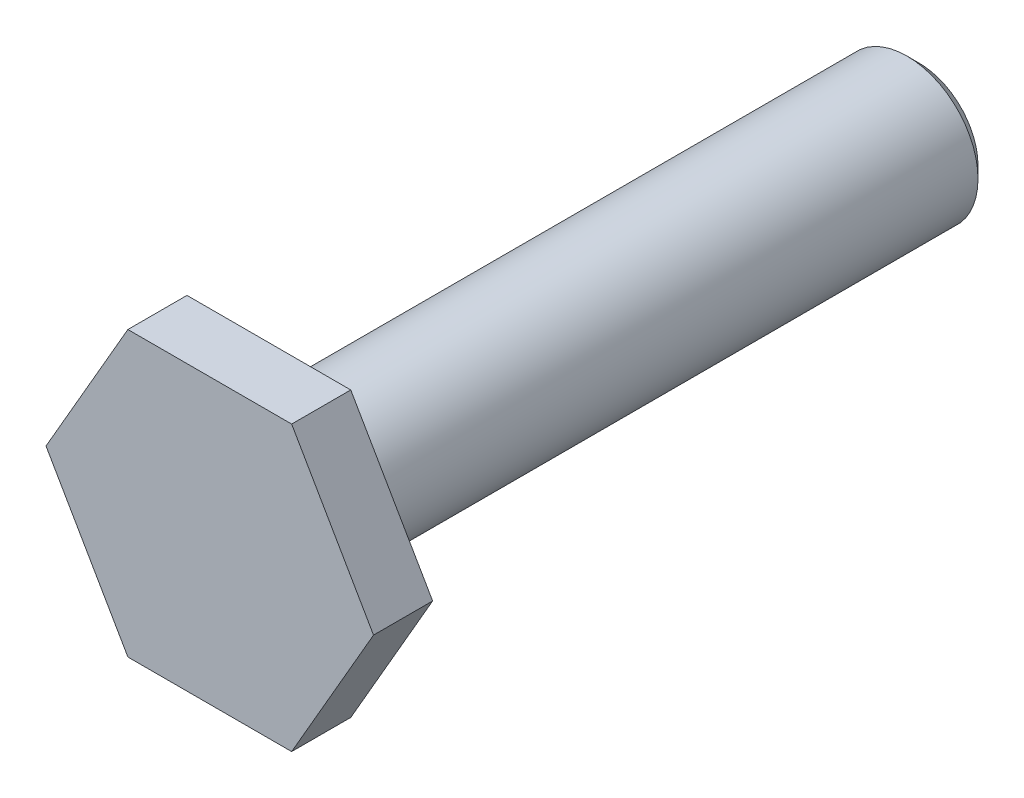
ISO-10303-21;
HEADER;
FILE_DESCRIPTION(('STEP AP214'),'2;1');
FILE_NAME('part.step','',(''),(''),'','','');
FILE_SCHEMA(('AUTOMOTIVE_DESIGN { 1 0 10303 214 1 1 1 1 }'));
ENDSEC;
DATA;
#1=APPLICATION_CONTEXT('core data for automotive mechanical design processes');
#2=APPLICATION_PROTOCOL_DEFINITION('international standard','automotive_design',2000,#1);
#3=PRODUCT_CONTEXT('',#1,'mechanical');
#4=PRODUCT('Part','Part','',(#3));
#5=PRODUCT_RELATED_PRODUCT_CATEGORY('part','',(#4));
#6=PRODUCT_DEFINITION_FORMATION('','',#4);
#7=PRODUCT_DEFINITION_CONTEXT('part definition',#1,'design');
#8=PRODUCT_DEFINITION('design','',#6,#7);
#9=PRODUCT_DEFINITION_SHAPE('','',#8);
#10=(LENGTH_UNIT() NAMED_UNIT(*) SI_UNIT(.MILLI.,.METRE.));
#11=(NAMED_UNIT(*) PLANE_ANGLE_UNIT() SI_UNIT($,.RADIAN.));
#12=(NAMED_UNIT(*) SI_UNIT($,.STERADIAN.) SOLID_ANGLE_UNIT());
#13=UNCERTAINTY_MEASURE_WITH_UNIT(LENGTH_MEASURE(1.E-05),#10,'distance_accuracy_value','');
#14=(GEOMETRIC_REPRESENTATION_CONTEXT(3) GLOBAL_UNCERTAINTY_ASSIGNED_CONTEXT((#13)) GLOBAL_UNIT_ASSIGNED_CONTEXT((#10,
#11,#12)) REPRESENTATION_CONTEXT('',''));
#15=CARTESIAN_POINT('',(0.,0.,0.));
#16=DIRECTION('',(0.,0.,1.));
#17=DIRECTION('',(1.,0.,0.));
#18=AXIS2_PLACEMENT_3D('',#15,#16,#17);
#19=CARTESIAN_POINT('',(0.,0.,5.));
#20=DIRECTION('',(0.,0.,1.));
#21=DIRECTION('',(1.,0.,0.));
#22=AXIS2_PLACEMENT_3D('',#19,#20,#21);
#23=PLANE('',#22);
#24=DIRECTION('',(0.5,-0.866025403784439,0.));
#25=VECTOR('',#24,1.);
#26=CARTESIAN_POINT('',(-6.92820323027551,-12.,5.));
#27=LINE('',#26,#25);
#28=CARTESIAN_POINT('',(-6.92820323027551,-12.,5.));
#29=VERTEX_POINT('',#28);
#30=CARTESIAN_POINT('',(-13.856406460551,0.,5.));
#31=VERTEX_POINT('',#30);
#32=EDGE_CURVE('E90',#29,#31,#27,.F.);
#33=ORIENTED_EDGE('',*,*,#32,.F.);
#34=DIRECTION('',(1.,0.,0.));
#35=VECTOR('',#34,1.);
#36=CARTESIAN_POINT('',(6.92820323027551,-12.,5.));
#37=LINE('',#36,#35);
#38=CARTESIAN_POINT('',(6.92820323027551,-12.,5.));
#39=VERTEX_POINT('',#38);
#40=EDGE_CURVE('E99',#39,#29,#37,.F.);
#41=ORIENTED_EDGE('',*,*,#40,.F.);
#42=DIRECTION('',(0.5,0.866025403784439,0.));
#43=VECTOR('',#42,1.);
#44=CARTESIAN_POINT('',(13.856406460551,0.,5.));
#45=LINE('',#44,#43);
#46=CARTESIAN_POINT('',(13.856406460551,0.,5.));
#47=VERTEX_POINT('',#46);
#48=EDGE_CURVE('E63',#47,#39,#45,.F.);
#49=ORIENTED_EDGE('',*,*,#48,.F.);
#50=DIRECTION('',(-0.5,0.866025403784439,0.));
#51=VECTOR('',#50,1.);
#52=CARTESIAN_POINT('',(6.92820323027552,12.,5.));
#53=LINE('',#52,#51);
#54=CARTESIAN_POINT('',(6.92820323027552,12.,5.));
#55=VERTEX_POINT('',#54);
#56=EDGE_CURVE('E67',#55,#47,#53,.F.);
#57=ORIENTED_EDGE('',*,*,#56,.F.);
#58=DIRECTION('',(1.,0.,0.));
#59=VECTOR('',#58,1.);
#60=CARTESIAN_POINT('',(-6.92820323027551,12.,5.));
#61=LINE('',#60,#59);
#62=CARTESIAN_POINT('',(-6.92820323027551,12.,5.));
#63=VERTEX_POINT('',#62);
#64=EDGE_CURVE('E77',#63,#55,#61,.T.);
#65=ORIENTED_EDGE('',*,*,#64,.F.);
#66=DIRECTION('',(-0.5,-0.866025403784439,0.));
#67=VECTOR('',#66,1.);
#68=CARTESIAN_POINT('',(-13.856406460551,0.,5.));
#69=LINE('',#68,#67);
#70=EDGE_CURVE('E80',#31,#63,#69,.F.);
#71=ORIENTED_EDGE('',*,*,#70,.F.);
#72=EDGE_LOOP('',(#33,#41,#49,#57,#65,#71));
#73=FACE_BOUND('',#72,.T.);
#74=ADVANCED_FACE('F17',(#73),#23,.T.);
#75=CARTESIAN_POINT('',(-6.92820323027551,12.,0.));
#76=DIRECTION('',(0.,1.,0.));
#77=DIRECTION('',(0.,0.,1.));
#78=AXIS2_PLACEMENT_3D('',#75,#76,#77);
#79=PLANE('',#78);
#80=DIRECTION('',(1.,0.,0.));
#81=VECTOR('',#80,1.);
#82=CARTESIAN_POINT('',(0.,12.,0.));
#83=LINE('',#82,#81);
#84=CARTESIAN_POINT('',(6.92820323027552,12.,0.));
#85=VERTEX_POINT('',#84);
#86=CARTESIAN_POINT('',(-6.92820323027551,12.,0.));
#87=VERTEX_POINT('',#86);
#88=EDGE_CURVE('E87',#85,#87,#83,.F.);
#89=ORIENTED_EDGE('',*,*,#88,.T.);
#90=DIRECTION('',(0.,0.,1.));
#91=VECTOR('',#90,1.);
#92=CARTESIAN_POINT('',(-6.92820323027551,12.,0.));
#93=LINE('',#92,#91);
#94=EDGE_CURVE('E84',#63,#87,#93,.F.);
#95=ORIENTED_EDGE('',*,*,#94,.F.);
#96=ORIENTED_EDGE('',*,*,#64,.T.);
#97=DIRECTION('',(0.,0.,1.));
#98=VECTOR('',#97,1.);
#99=CARTESIAN_POINT('',(6.92820323027552,12.,0.));
#100=LINE('',#99,#98);
#101=EDGE_CURVE('E55',#85,#55,#100,.T.);
#102=ORIENTED_EDGE('',*,*,#101,.F.);
#103=EDGE_LOOP('',(#89,#95,#96,#102));
#104=FACE_BOUND('',#103,.T.);
#105=ADVANCED_FACE('F85',(#104),#79,.T.);
#106=CARTESIAN_POINT('',(-13.856406460551,0.,0.));
#107=DIRECTION('',(-0.866025403784439,0.5,0.));
#108=DIRECTION('',(-0.5,-0.866025403784439,0.));
#109=AXIS2_PLACEMENT_3D('',#106,#107,#108);
#110=PLANE('',#109);
#111=DIRECTION('',(-0.5,-0.866025403784439,0.));
#112=VECTOR('',#111,1.);
#113=CARTESIAN_POINT('',(-6.92820323027551,12.,0.));
#114=LINE('',#113,#112);
#115=CARTESIAN_POINT('',(-13.856406460551,0.,0.));
#116=VERTEX_POINT('',#115);
#117=EDGE_CURVE('E120',#87,#116,#114,.T.);
#118=ORIENTED_EDGE('',*,*,#117,.T.);
#119=DIRECTION('',(0.,0.,1.));
#120=VECTOR('',#119,1.);
#121=CARTESIAN_POINT('',(-13.856406460551,0.,0.));
#122=LINE('',#121,#120);
#123=EDGE_CURVE('E94',#31,#116,#122,.F.);
#124=ORIENTED_EDGE('',*,*,#123,.F.);
#125=ORIENTED_EDGE('',*,*,#70,.T.);
#126=ORIENTED_EDGE('',*,*,#94,.T.);
#127=EDGE_LOOP('',(#118,#124,#125,#126));
#128=FACE_BOUND('',#127,.T.);
#129=ADVANCED_FACE('F92',(#128),#110,.T.);
#130=CARTESIAN_POINT('',(-6.92820323027551,-12.,0.));
#131=DIRECTION('',(-0.866025403784439,-0.5,0.));
#132=DIRECTION('',(0.5,-0.866025403784439,0.));
#133=AXIS2_PLACEMENT_3D('',#130,#131,#132);
#134=PLANE('',#133);
#135=DIRECTION('',(0.5,-0.866025403784439,0.));
#136=VECTOR('',#135,1.);
#137=CARTESIAN_POINT('',(-13.856406460551,0.,0.));
#138=LINE('',#137,#136);
#139=CARTESIAN_POINT('',(-6.92820323027551,-12.,0.));
#140=VERTEX_POINT('',#139);
#141=EDGE_CURVE('E118',#116,#140,#138,.T.);
#142=ORIENTED_EDGE('',*,*,#141,.T.);
#143=DIRECTION('',(0.,0.,1.));
#144=VECTOR('',#143,1.);
#145=CARTESIAN_POINT('',(-6.92820323027551,-12.,0.));
#146=LINE('',#145,#144);
#147=EDGE_CURVE('E101',#29,#140,#146,.F.);
#148=ORIENTED_EDGE('',*,*,#147,.F.);
#149=ORIENTED_EDGE('',*,*,#32,.T.);
#150=ORIENTED_EDGE('',*,*,#123,.T.);
#151=EDGE_LOOP('',(#142,#148,#149,#150));
#152=FACE_BOUND('',#151,.T.);
#153=ADVANCED_FACE('F191',(#152),#134,.T.);
#154=CARTESIAN_POINT('',(6.92820323027551,-12.,0.));
#155=DIRECTION('',(0.,-1.,0.));
#156=DIRECTION('',(1.,0.,0.));
#157=AXIS2_PLACEMENT_3D('',#154,#155,#156);
#158=PLANE('',#157);
#159=DIRECTION('',(1.,0.,0.));
#160=VECTOR('',#159,1.);
#161=CARTESIAN_POINT('',(0.,-12.,0.));
#162=LINE('',#161,#160);
#163=CARTESIAN_POINT('',(6.92820323027551,-12.,0.));
#164=VERTEX_POINT('',#163);
#165=EDGE_CURVE('E116',#140,#164,#162,.T.);
#166=ORIENTED_EDGE('',*,*,#165,.T.);
#167=DIRECTION('',(0.,0.,1.));
#168=VECTOR('',#167,1.);
#169=CARTESIAN_POINT('',(6.9282032302755,-12.,0.));
#170=LINE('',#169,#168);
#171=EDGE_CURVE('E106',#39,#164,#170,.F.);
#172=ORIENTED_EDGE('',*,*,#171,.F.);
#173=ORIENTED_EDGE('',*,*,#40,.T.);
#174=ORIENTED_EDGE('',*,*,#147,.T.);
#175=EDGE_LOOP('',(#166,#172,#173,#174));
#176=FACE_BOUND('',#175,.T.);
#177=ADVANCED_FACE('F182',(#176),#158,.T.);
#178=CARTESIAN_POINT('',(13.856406460551,0.,0.));
#179=DIRECTION('',(0.866025403784438,-0.5,0.));
#180=DIRECTION('',(0.5,0.866025403784439,0.));
#181=AXIS2_PLACEMENT_3D('',#178,#179,#180);
#182=PLANE('',#181);
#183=DIRECTION('',(0.5,0.866025403784439,0.));
#184=VECTOR('',#183,1.);
#185=CARTESIAN_POINT('',(6.92820323027551,-12.,0.));
#186=LINE('',#185,#184);
#187=CARTESIAN_POINT('',(13.856406460551,0.,0.));
#188=VERTEX_POINT('',#187);
#189=EDGE_CURVE('E36',#164,#188,#186,.T.);
#190=ORIENTED_EDGE('',*,*,#189,.T.);
#191=DIRECTION('',(0.,0.,1.));
#192=VECTOR('',#191,1.);
#193=CARTESIAN_POINT('',(13.856406460551,0.,0.));
#194=LINE('',#193,#192);
#195=EDGE_CURVE('E110',#47,#188,#194,.F.);
#196=ORIENTED_EDGE('',*,*,#195,.F.);
#197=ORIENTED_EDGE('',*,*,#48,.T.);
#198=ORIENTED_EDGE('',*,*,#171,.T.);
#199=EDGE_LOOP('',(#190,#196,#197,#198));
#200=FACE_BOUND('',#199,.T.);
#201=ADVANCED_FACE('F143',(#200),#182,.T.);
#202=CARTESIAN_POINT('',(6.92820323027552,12.,0.));
#203=DIRECTION('',(0.866025403784439,0.5,0.));
#204=DIRECTION('',(-0.5,0.866025403784439,0.));
#205=AXIS2_PLACEMENT_3D('',#202,#203,#204);
#206=PLANE('',#205);
#207=DIRECTION('',(-0.5,0.866025403784439,0.));
#208=VECTOR('',#207,1.);
#209=CARTESIAN_POINT('',(13.856406460551,0.,0.));
#210=LINE('',#209,#208);
#211=EDGE_CURVE('E113',#188,#85,#210,.T.);
#212=ORIENTED_EDGE('',*,*,#211,.T.);
#213=ORIENTED_EDGE('',*,*,#101,.T.);
#214=ORIENTED_EDGE('',*,*,#56,.T.);
#215=ORIENTED_EDGE('',*,*,#195,.T.);
#216=EDGE_LOOP('',(#212,#213,#214,#215));
#217=FACE_BOUND('',#216,.T.);
#218=ADVANCED_FACE('F134',(#217),#206,.T.);
#219=CARTESIAN_POINT('',(0.,0.,-55.));
#220=DIRECTION('',(0.,0.,1.));
#221=DIRECTION('',(1.,0.,0.));
#222=AXIS2_PLACEMENT_3D('',#219,#220,#221);
#223=PLANE('',#222);
#224=CARTESIAN_POINT('',(0.,0.,-54.9999999999038));
#225=DIRECTION('',(0.,0.,1.));
#226=DIRECTION('',(1.,0.,0.));
#227=AXIS2_PLACEMENT_3D('',#224,#225,#226);
#228=CIRCLE('',#227,5.00000000004164);
#229=CARTESIAN_POINT('',(5.00000000004164,0.,-54.9999999999038));
#230=VERTEX_POINT('',#229);
#231=EDGE_CURVE('E21',#230,#230,#228,.T.);
#232=ORIENTED_EDGE('',*,*,#231,.F.);
#233=EDGE_LOOP('',(#232));
#234=FACE_BOUND('',#233,.T.);
#235=ADVANCED_FACE('F131',(#234),#223,.F.);
#236=CARTESIAN_POINT('',(0.,0.,0.));
#237=DIRECTION('',(0.,0.,1.));
#238=DIRECTION('',(1.,0.,0.));
#239=AXIS2_PLACEMENT_3D('',#236,#237,#238);
#240=PLANE('',#239);
#241=ORIENTED_EDGE('',*,*,#189,.F.);
#242=ORIENTED_EDGE('',*,*,#165,.F.);
#243=ORIENTED_EDGE('',*,*,#141,.F.);
#244=ORIENTED_EDGE('',*,*,#117,.F.);
#245=ORIENTED_EDGE('',*,*,#88,.F.);
#246=ORIENTED_EDGE('',*,*,#211,.F.);
#247=EDGE_LOOP('',(#241,#242,#243,#244,#245,#246));
#248=FACE_BOUND('',#247,.T.);
#249=CARTESIAN_POINT('',(0.,0.,0.));
#250=DIRECTION('',(0.,0.,-1.));
#251=DIRECTION('',(-1.,0.,0.));
#252=AXIS2_PLACEMENT_3D('',#249,#250,#251);
#253=CIRCLE('',#252,6.);
#254=CARTESIAN_POINT('',(-6.,0.,0.));
#255=VERTEX_POINT('',#254);
#256=EDGE_CURVE('E27',#255,#255,#253,.T.);
#257=ORIENTED_EDGE('',*,*,#256,.F.);
#258=EDGE_LOOP('',(#257));
#259=FACE_BOUND('',#258,.T.);
#260=ADVANCED_FACE('F133',(#248,#259),#240,.F.);
#261=CARTESIAN_POINT('',(0.,0.,-53.9999999999168));
#262=DIRECTION('',(0.,0.,1.));
#263=DIRECTION('',(1.,0.,0.));
#264=AXIS2_PLACEMENT_3D('',#261,#262,#263);
#265=CONICAL_SURFACE('',#264,6.00000000008549,0.78539816342587);
#266=ORIENTED_EDGE('',*,*,#231,.T.);
#267=EDGE_LOOP('',(#266));
#268=FACE_BOUND('',#267,.T.);
#269=CARTESIAN_POINT('',(0.,0.,-54.));
#270=DIRECTION('',(0.,0.,-1.));
#271=DIRECTION('',(-1.,0.,0.));
#272=AXIS2_PLACEMENT_3D('',#269,#270,#271);
#273=CIRCLE('',#272,6.);
#274=CARTESIAN_POINT('',(-6.,0.,-54.));
#275=VERTEX_POINT('',#274);
#276=EDGE_CURVE('E11',#275,#275,#273,.F.);
#277=ORIENTED_EDGE('',*,*,#276,.F.);
#278=EDGE_LOOP('',(#277));
#279=FACE_BOUND('',#278,.T.);
#280=ADVANCED_FACE('F128',(#268,#279),#265,.T.);
#281=CARTESIAN_POINT('',(0.,0.,0.));
#282=DIRECTION('',(0.,0.,-1.));
#283=DIRECTION('',(-1.,0.,0.));
#284=AXIS2_PLACEMENT_3D('',#281,#282,#283);
#285=CYLINDRICAL_SURFACE('',#284,6.);
#286=ORIENTED_EDGE('',*,*,#256,.T.);
#287=EDGE_LOOP('',(#286));
#288=FACE_BOUND('',#287,.T.);
#289=ORIENTED_EDGE('',*,*,#276,.T.);
#290=EDGE_LOOP('',(#289));
#291=FACE_BOUND('',#290,.T.);
#292=ADVANCED_FACE('F19',(#288,#291),#285,.T.);
#293=CLOSED_SHELL('',(#74,#105,#129,#153,#177,#201,#218,#235,#260,#280,#292));
#294=MANIFOLD_SOLID_BREP('B1',#293);
#295=ADVANCED_BREP_SHAPE_REPRESENTATION('',(#18,#294),#14);
#296=SHAPE_DEFINITION_REPRESENTATION(#9,#295);
ENDSEC;
END-ISO-10303-21;
